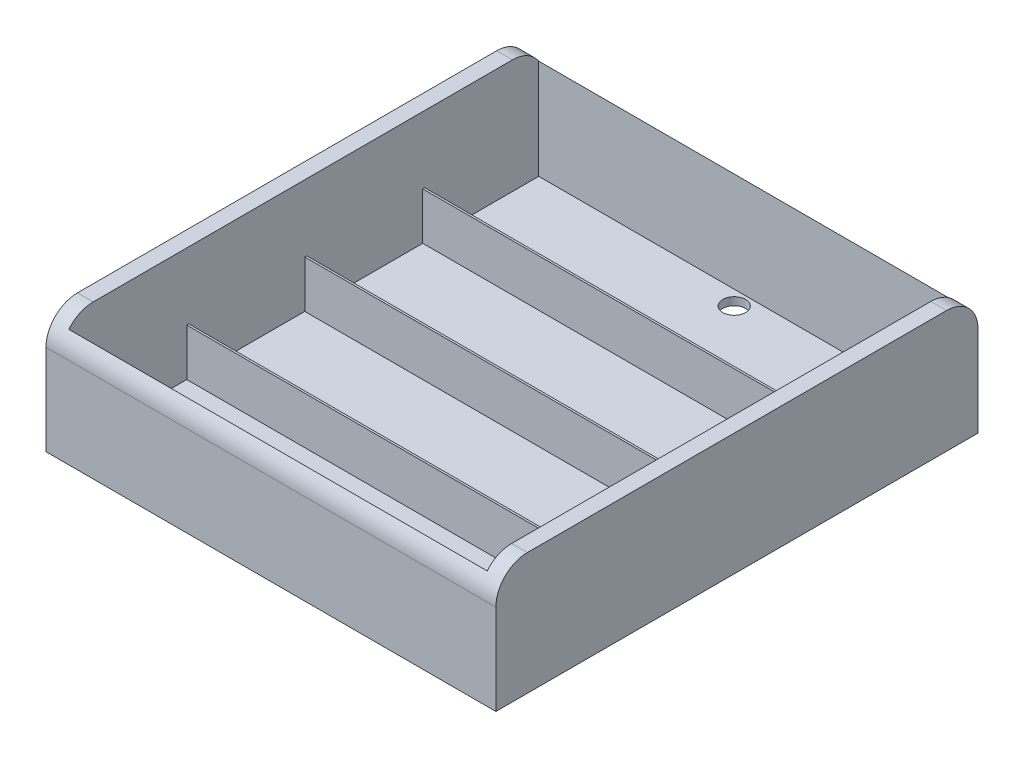
ISO-10303-21;
HEADER;
FILE_DESCRIPTION(('STEP AP214'),'2;1');
FILE_NAME('part.step','',(''),(''),'','','');
FILE_SCHEMA(('AUTOMOTIVE_DESIGN { 1 0 10303 214 1 1 1 1 }'));
ENDSEC;
DATA;
#1=APPLICATION_CONTEXT('core data for automotive mechanical design processes');
#2=APPLICATION_PROTOCOL_DEFINITION('international standard','automotive_design',2000,#1);
#3=PRODUCT_CONTEXT('',#1,'mechanical');
#4=PRODUCT('Part','Part','',(#3));
#5=PRODUCT_RELATED_PRODUCT_CATEGORY('part','',(#4));
#6=PRODUCT_DEFINITION_FORMATION('','',#4);
#7=PRODUCT_DEFINITION_CONTEXT('part definition',#1,'design');
#8=PRODUCT_DEFINITION('design','',#6,#7);
#9=PRODUCT_DEFINITION_SHAPE('','',#8);
#10=(LENGTH_UNIT() NAMED_UNIT(*) SI_UNIT(.MILLI.,.METRE.));
#11=(NAMED_UNIT(*) PLANE_ANGLE_UNIT() SI_UNIT($,.RADIAN.));
#12=(NAMED_UNIT(*) SI_UNIT($,.STERADIAN.) SOLID_ANGLE_UNIT());
#13=UNCERTAINTY_MEASURE_WITH_UNIT(LENGTH_MEASURE(1.E-05),#10,'distance_accuracy_value','');
#14=(GEOMETRIC_REPRESENTATION_CONTEXT(3) GLOBAL_UNCERTAINTY_ASSIGNED_CONTEXT((#13)) GLOBAL_UNIT_ASSIGNED_CONTEXT((#10,
#11,#12)) REPRESENTATION_CONTEXT('',''));
#15=CARTESIAN_POINT('',(0.,0.,0.));
#16=DIRECTION('',(0.,0.,1.));
#17=DIRECTION('',(1.,0.,0.));
#18=AXIS2_PLACEMENT_3D('',#15,#16,#17);
#19=CARTESIAN_POINT('',(0.,1.,-61.3));
#20=DIRECTION('',(0.,-1.,0.));
#21=DIRECTION('',(0.,0.,-1.));
#22=AXIS2_PLACEMENT_3D('',#19,#20,#21);
#23=PLANE('',#22);
#24=DIRECTION('',(1.,0.,0.));
#25=VECTOR('',#24,1.);
#26=CARTESIAN_POINT('',(1.99999999999999,1.,-45.9));
#27=LINE('',#26,#25);
#28=CARTESIAN_POINT('',(1.99999999999999,1.,-45.9));
#29=VERTEX_POINT('',#28);
#30=CARTESIAN_POINT('',(55.2,1.,-45.9));
#31=VERTEX_POINT('',#30);
#32=EDGE_CURVE('E426',#29,#31,#27,.T.);
#33=ORIENTED_EDGE('',*,*,#32,.F.);
#34=DIRECTION('',(0.,0.,1.));
#35=VECTOR('',#34,1.);
#36=CARTESIAN_POINT('',(1.99999999999999,1.,-60.65));
#37=LINE('',#36,#35);
#38=CARTESIAN_POINT('',(1.99999999999999,1.,-31.15));
#39=VERTEX_POINT('',#38);
#40=EDGE_CURVE('E218',#29,#39,#37,.T.);
#41=ORIENTED_EDGE('',*,*,#40,.T.);
#42=DIRECTION('',(-1.,0.,0.));
#43=VECTOR('',#42,1.);
#44=CARTESIAN_POINT('',(1.99999999999999,1.,-31.15));
#45=LINE('',#44,#43);
#46=CARTESIAN_POINT('',(55.2,1.,-31.15));
#47=VERTEX_POINT('',#46);
#48=EDGE_CURVE('E221',#47,#39,#45,.T.);
#49=ORIENTED_EDGE('',*,*,#48,.F.);
#50=DIRECTION('',(0.,0.,-1.));
#51=VECTOR('',#50,1.);
#52=CARTESIAN_POINT('',(55.2,1.,-60.65));
#53=LINE('',#52,#51);
#54=EDGE_CURVE('E435',#47,#31,#53,.T.);
#55=ORIENTED_EDGE('',*,*,#54,.T.);
#56=EDGE_LOOP('',(#33,#41,#49,#55));
#57=FACE_BOUND('',#56,.T.);
#58=ADVANCED_FACE('F35',(#57),#23,.F.);
#59=CARTESIAN_POINT('',(28.7,1.,-58.8));
#60=DIRECTION('',(0.,-1.,0.));
#61=DIRECTION('',(0.,0.,-1.));
#62=AXIS2_PLACEMENT_3D('',#59,#60,#61);
#63=CIRCLE('',#62,1.44999999999999);
#64=CARTESIAN_POINT('',(28.7,1.,-60.25));
#65=VERTEX_POINT('',#64);
#66=EDGE_CURVE('E303',#65,#65,#63,.F.);
#67=ORIENTED_EDGE('',*,*,#66,.F.);
#68=EDGE_LOOP('',(#67));
#69=FACE_BOUND('',#68,.T.);
#70=DIRECTION('',(-1.,0.,0.));
#71=VECTOR('',#70,1.);
#72=CARTESIAN_POINT('',(1.99999999999999,1.,-46.15));
#73=LINE('',#72,#71);
#74=CARTESIAN_POINT('',(55.2,1.,-46.15));
#75=VERTEX_POINT('',#74);
#76=CARTESIAN_POINT('',(1.99999999999999,1.,-46.15));
#77=VERTEX_POINT('',#76);
#78=EDGE_CURVE('E214',#75,#77,#73,.T.);
#79=ORIENTED_EDGE('',*,*,#78,.F.);
#80=CARTESIAN_POINT('',(55.2,1.,-60.65));
#81=VERTEX_POINT('',#80);
#82=EDGE_CURVE('E294',#75,#81,#53,.T.);
#83=ORIENTED_EDGE('',*,*,#82,.T.);
#84=DIRECTION('',(-1.,0.,0.));
#85=VECTOR('',#84,1.);
#86=CARTESIAN_POINT('',(1.99999999999999,1.,-60.65));
#87=LINE('',#86,#85);
#88=CARTESIAN_POINT('',(1.99999999999999,1.,-60.65));
#89=VERTEX_POINT('',#88);
#90=EDGE_CURVE('E285',#81,#89,#87,.T.);
#91=ORIENTED_EDGE('',*,*,#90,.T.);
#92=EDGE_CURVE('E280',#89,#77,#37,.T.);
#93=ORIENTED_EDGE('',*,*,#92,.T.);
#94=EDGE_LOOP('',(#79,#83,#91,#93));
#95=FACE_BOUND('',#94,.T.);
#96=ADVANCED_FACE('F439',(#69,#95),#23,.F.);
#97=CARTESIAN_POINT('',(55.2,-80.0018906026602,-60.65));
#98=DIRECTION('',(1.,0.,0.));
#99=DIRECTION('',(0.,0.,-1.));
#100=AXIS2_PLACEMENT_3D('',#97,#98,#99);
#101=PLANE('',#100);
#102=DIRECTION('',(0.,-1.,0.));
#103=VECTOR('',#102,1.);
#104=CARTESIAN_POINT('',(55.2,7.,-45.9));
#105=LINE('',#104,#103);
#106=CARTESIAN_POINT('',(55.2,7.,-45.9));
#107=VERTEX_POINT('',#106);
#108=EDGE_CURVE('E204',#107,#31,#105,.T.);
#109=ORIENTED_EDGE('',*,*,#108,.T.);
#110=ORIENTED_EDGE('',*,*,#54,.F.);
#111=DIRECTION('',(0.,-1.,0.));
#112=VECTOR('',#111,1.);
#113=CARTESIAN_POINT('',(55.2,7.,-31.15));
#114=LINE('',#113,#112);
#115=CARTESIAN_POINT('',(55.2,7.,-31.15));
#116=VERTEX_POINT('',#115);
#117=EDGE_CURVE('E238',#116,#47,#114,.T.);
#118=ORIENTED_EDGE('',*,*,#117,.F.);
#119=DIRECTION('',(0.,0.,-1.));
#120=VECTOR('',#119,1.);
#121=CARTESIAN_POINT('',(55.2,7.,-31.15));
#122=LINE('',#121,#120);
#123=CARTESIAN_POINT('',(55.2,7.,-30.9));
#124=VERTEX_POINT('',#123);
#125=EDGE_CURVE('E232',#124,#116,#122,.T.);
#126=ORIENTED_EDGE('',*,*,#125,.F.);
#127=DIRECTION('',(0.,-1.,0.));
#128=VECTOR('',#127,1.);
#129=CARTESIAN_POINT('',(55.2,7.,-30.9));
#130=LINE('',#129,#128);
#131=CARTESIAN_POINT('',(55.2,1.,-30.9));
#132=VERTEX_POINT('',#131);
#133=EDGE_CURVE('E240',#124,#132,#130,.T.);
#134=ORIENTED_EDGE('',*,*,#133,.T.);
#135=CARTESIAN_POINT('',(55.2,1.,-16.15));
#136=VERTEX_POINT('',#135);
#137=EDGE_CURVE('E293',#136,#132,#53,.T.);
#138=ORIENTED_EDGE('',*,*,#137,.F.);
#139=DIRECTION('',(0.,-1.,0.));
#140=VECTOR('',#139,1.);
#141=CARTESIAN_POINT('',(55.2,7.,-16.15));
#142=LINE('',#141,#140);
#143=CARTESIAN_POINT('',(55.2,7.,-16.15));
#144=VERTEX_POINT('',#143);
#145=EDGE_CURVE('E263',#144,#136,#142,.T.);
#146=ORIENTED_EDGE('',*,*,#145,.F.);
#147=DIRECTION('',(0.,0.,-1.));
#148=VECTOR('',#147,1.);
#149=CARTESIAN_POINT('',(55.2,7.,-16.15));
#150=LINE('',#149,#148);
#151=CARTESIAN_POINT('',(55.2,7.,-15.9));
#152=VERTEX_POINT('',#151);
#153=EDGE_CURVE('E252',#152,#144,#150,.T.);
#154=ORIENTED_EDGE('',*,*,#153,.F.);
#155=DIRECTION('',(0.,-1.,0.));
#156=VECTOR('',#155,1.);
#157=CARTESIAN_POINT('',(55.2,7.,-15.9));
#158=LINE('',#157,#156);
#159=CARTESIAN_POINT('',(55.2,1.,-15.9));
#160=VERTEX_POINT('',#159);
#161=EDGE_CURVE('E265',#152,#160,#158,.T.);
#162=ORIENTED_EDGE('',*,*,#161,.T.);
#163=CARTESIAN_POINT('',(55.2,1.,-0.9));
#164=VERTEX_POINT('',#163);
#165=EDGE_CURVE('E290',#164,#160,#53,.T.);
#166=ORIENTED_EDGE('',*,*,#165,.F.);
#167=DIRECTION('',(0.,1.,0.));
#168=VECTOR('',#167,1.);
#169=CARTESIAN_POINT('',(55.2,-80.0018906026602,-0.9));
#170=LINE('',#169,#168);
#171=CARTESIAN_POINT('',(55.2,14.0278449319529,-0.9));
#172=VERTEX_POINT('',#171);
#173=EDGE_CURVE('E279',#164,#172,#170,.T.);
#174=ORIENTED_EDGE('',*,*,#173,.T.);
#175=CARTESIAN_POINT('',(55.2,11.5,-4.));
#176=DIRECTION('',(1.,0.,0.));
#177=DIRECTION('',(0.,0.,-1.));
#178=AXIS2_PLACEMENT_3D('',#175,#176,#177);
#179=CIRCLE('',#178,4.);
#180=CARTESIAN_POINT('',(55.2,15.5,-4.));
#181=VERTEX_POINT('',#180);
#182=EDGE_CURVE('E351',#172,#181,#179,.F.);
#183=ORIENTED_EDGE('',*,*,#182,.T.);
#184=DIRECTION('',(0.,0.,-1.));
#185=VECTOR('',#184,1.);
#186=CARTESIAN_POINT('',(55.2,15.5,-60.65));
#187=LINE('',#186,#185);
#188=CARTESIAN_POINT('',(55.2,15.5,-57.3));
#189=VERTEX_POINT('',#188);
#190=EDGE_CURVE('E271',#181,#189,#187,.T.);
#191=ORIENTED_EDGE('',*,*,#190,.T.);
#192=CARTESIAN_POINT('',(55.2,11.5,-57.3));
#193=DIRECTION('',(1.,0.,0.));
#194=DIRECTION('',(0.,0.,-1.));
#195=AXIS2_PLACEMENT_3D('',#192,#193,#194);
#196=CIRCLE('',#195,4.);
#197=CARTESIAN_POINT('',(55.2,13.6857492994394,-60.65));
#198=VERTEX_POINT('',#197);
#199=EDGE_CURVE('E353',#189,#198,#196,.F.);
#200=ORIENTED_EDGE('',*,*,#199,.T.);
#201=DIRECTION('',(0.,1.,0.));
#202=VECTOR('',#201,1.);
#203=CARTESIAN_POINT('',(55.2,-80.0018906026602,-60.65));
#204=LINE('',#203,#202);
#205=EDGE_CURVE('E289',#81,#198,#204,.T.);
#206=ORIENTED_EDGE('',*,*,#205,.F.);
#207=ORIENTED_EDGE('',*,*,#82,.F.);
#208=DIRECTION('',(0.,-1.,0.));
#209=VECTOR('',#208,1.);
#210=CARTESIAN_POINT('',(55.2,7.,-46.15));
#211=LINE('',#210,#209);
#212=CARTESIAN_POINT('',(55.2,7.,-46.15));
#213=VERTEX_POINT('',#212);
#214=EDGE_CURVE('E223',#213,#75,#211,.T.);
#215=ORIENTED_EDGE('',*,*,#214,.F.);
#216=DIRECTION('',(0.,0.,-1.));
#217=VECTOR('',#216,1.);
#218=CARTESIAN_POINT('',(55.2,7.,-46.15));
#219=LINE('',#218,#217);
#220=EDGE_CURVE('E207',#107,#213,#219,.T.);
#221=ORIENTED_EDGE('',*,*,#220,.F.);
#222=EDGE_LOOP('',(#109,#110,#118,#126,#134,#138,#146,#154,#162,#166,#174,#183,#191,#200,#206,
#207,#215,#221));
#223=FACE_BOUND('',#222,.T.);
#224=ADVANCED_FACE('F379',(#223),#101,.F.);
#225=CARTESIAN_POINT('',(1.99999999999999,-80.0018906026602,-60.65));
#226=DIRECTION('',(-1.,0.,0.));
#227=DIRECTION('',(0.,0.,1.));
#228=AXIS2_PLACEMENT_3D('',#225,#226,#227);
#229=PLANE('',#228);
#230=DIRECTION('',(0.,-1.,0.));
#231=VECTOR('',#230,1.);
#232=CARTESIAN_POINT('',(1.99999999999999,7.,-45.9));
#233=LINE('',#232,#231);
#234=CARTESIAN_POINT('',(1.99999999999999,7.,-45.9));
#235=VERTEX_POINT('',#234);
#236=EDGE_CURVE('E201',#235,#29,#233,.T.);
#237=ORIENTED_EDGE('',*,*,#236,.F.);
#238=DIRECTION('',(0.,0.,1.));
#239=VECTOR('',#238,1.);
#240=CARTESIAN_POINT('',(1.99999999999999,7.,-46.15));
#241=LINE('',#240,#239);
#242=CARTESIAN_POINT('',(1.99999999999999,7.00000000000001,-46.15));
#243=VERTEX_POINT('',#242);
#244=EDGE_CURVE('E208',#243,#235,#241,.T.);
#245=ORIENTED_EDGE('',*,*,#244,.F.);
#246=DIRECTION('',(0.,-1.,0.));
#247=VECTOR('',#246,1.);
#248=CARTESIAN_POINT('',(1.99999999999999,7.,-46.15));
#249=LINE('',#248,#247);
#250=EDGE_CURVE('E50',#243,#77,#249,.T.);
#251=ORIENTED_EDGE('',*,*,#250,.T.);
#252=ORIENTED_EDGE('',*,*,#92,.F.);
#253=DIRECTION('',(0.,1.,0.));
#254=VECTOR('',#253,1.);
#255=CARTESIAN_POINT('',(1.99999999999999,-80.0018906026602,-60.65));
#256=LINE('',#255,#254);
#257=CARTESIAN_POINT('',(1.99999999999999,13.6857492994394,-60.65));
#258=VERTEX_POINT('',#257);
#259=EDGE_CURVE('E288',#89,#258,#256,.T.);
#260=ORIENTED_EDGE('',*,*,#259,.T.);
#261=CARTESIAN_POINT('',(1.99999999999999,11.5,-57.3));
#262=DIRECTION('',(-1.,0.,0.));
#263=DIRECTION('',(0.,0.,1.));
#264=AXIS2_PLACEMENT_3D('',#261,#262,#263);
#265=CIRCLE('',#264,4.);
#266=CARTESIAN_POINT('',(1.99999999999999,15.5,-57.3));
#267=VERTEX_POINT('',#266);
#268=EDGE_CURVE('E359',#258,#267,#265,.F.);
#269=ORIENTED_EDGE('',*,*,#268,.T.);
#270=DIRECTION('',(0.,0.,1.));
#271=VECTOR('',#270,1.);
#272=CARTESIAN_POINT('',(1.99999999999999,15.5,-60.65));
#273=LINE('',#272,#271);
#274=CARTESIAN_POINT('',(2.,15.5,-4.));
#275=VERTEX_POINT('',#274);
#276=EDGE_CURVE('E270',#267,#275,#273,.T.);
#277=ORIENTED_EDGE('',*,*,#276,.T.);
#278=CARTESIAN_POINT('',(2.,11.5,-4.));
#279=DIRECTION('',(-1.,0.,0.));
#280=DIRECTION('',(0.,0.,1.));
#281=AXIS2_PLACEMENT_3D('',#278,#279,#280);
#282=CIRCLE('',#281,4.);
#283=CARTESIAN_POINT('',(2.,14.0278449319529,-0.9));
#284=VERTEX_POINT('',#283);
#285=EDGE_CURVE('E357',#275,#284,#282,.F.);
#286=ORIENTED_EDGE('',*,*,#285,.T.);
#287=DIRECTION('',(0.,1.,0.));
#288=VECTOR('',#287,1.);
#289=CARTESIAN_POINT('',(2.,-80.0018906026602,-0.9));
#290=LINE('',#289,#288);
#291=CARTESIAN_POINT('',(2.,1.,-0.9));
#292=VERTEX_POINT('',#291);
#293=EDGE_CURVE('E283',#292,#284,#290,.T.);
#294=ORIENTED_EDGE('',*,*,#293,.F.);
#295=CARTESIAN_POINT('',(1.99999999999999,1.,-15.9));
#296=VERTEX_POINT('',#295);
#297=EDGE_CURVE('E284',#296,#292,#37,.T.);
#298=ORIENTED_EDGE('',*,*,#297,.F.);
#299=DIRECTION('',(0.,-1.,0.));
#300=VECTOR('',#299,1.);
#301=CARTESIAN_POINT('',(1.99999999999999,7.,-15.9));
#302=LINE('',#301,#300);
#303=CARTESIAN_POINT('',(1.99999999999999,7.,-15.9));
#304=VERTEX_POINT('',#303);
#305=EDGE_CURVE('E268',#304,#296,#302,.T.);
#306=ORIENTED_EDGE('',*,*,#305,.F.);
#307=DIRECTION('',(0.,0.,1.));
#308=VECTOR('',#307,1.);
#309=CARTESIAN_POINT('',(1.99999999999999,7.,-16.15));
#310=LINE('',#309,#308);
#311=CARTESIAN_POINT('',(1.99999999999999,7.00000000000001,-16.15));
#312=VERTEX_POINT('',#311);
#313=EDGE_CURVE('E246',#312,#304,#310,.T.);
#314=ORIENTED_EDGE('',*,*,#313,.F.);
#315=DIRECTION('',(0.,-1.,0.));
#316=VECTOR('',#315,1.);
#317=CARTESIAN_POINT('',(1.99999999999999,7.,-16.15));
#318=LINE('',#317,#316);
#319=CARTESIAN_POINT('',(1.99999999999999,1.,-16.15));
#320=VERTEX_POINT('',#319);
#321=EDGE_CURVE('E257',#312,#320,#318,.T.);
#322=ORIENTED_EDGE('',*,*,#321,.T.);
#323=CARTESIAN_POINT('',(1.99999999999999,1.,-30.9));
#324=VERTEX_POINT('',#323);
#325=EDGE_CURVE('E417',#324,#320,#37,.T.);
#326=ORIENTED_EDGE('',*,*,#325,.F.);
#327=DIRECTION('',(0.,-1.,0.));
#328=VECTOR('',#327,1.);
#329=CARTESIAN_POINT('',(1.99999999999999,7.,-30.9));
#330=LINE('',#329,#328);
#331=CARTESIAN_POINT('',(1.99999999999999,7.,-30.9));
#332=VERTEX_POINT('',#331);
#333=EDGE_CURVE('E243',#332,#324,#330,.T.);
#334=ORIENTED_EDGE('',*,*,#333,.F.);
#335=DIRECTION('',(0.,0.,1.));
#336=VECTOR('',#335,1.);
#337=CARTESIAN_POINT('',(1.99999999999999,7.,-31.15));
#338=LINE('',#337,#336);
#339=CARTESIAN_POINT('',(1.99999999999999,7.00000000000001,-31.15));
#340=VERTEX_POINT('',#339);
#341=EDGE_CURVE('E227',#340,#332,#338,.T.);
#342=ORIENTED_EDGE('',*,*,#341,.F.);
#343=DIRECTION('',(0.,-1.,0.));
#344=VECTOR('',#343,1.);
#345=CARTESIAN_POINT('',(1.99999999999999,7.,-31.15));
#346=LINE('',#345,#344);
#347=EDGE_CURVE('E58',#340,#39,#346,.T.);
#348=ORIENTED_EDGE('',*,*,#347,.T.);
#349=ORIENTED_EDGE('',*,*,#40,.F.);
#350=EDGE_LOOP('',(#237,#245,#251,#252,#260,#269,#277,#286,#294,#298,#306,#314,#322,#326,#334,
#342,#348,#349));
#351=FACE_BOUND('',#350,.T.);
#352=ADVANCED_FACE('F217',(#351),#229,.F.);
#353=DIRECTION('',(1.,0.,0.));
#354=VECTOR('',#353,1.);
#355=CARTESIAN_POINT('',(1.99999999999999,1.,-30.9));
#356=LINE('',#355,#354);
#357=EDGE_CURVE('E219',#324,#132,#356,.T.);
#358=ORIENTED_EDGE('',*,*,#357,.F.);
#359=ORIENTED_EDGE('',*,*,#325,.T.);
#360=DIRECTION('',(-1.,0.,0.));
#361=VECTOR('',#360,1.);
#362=CARTESIAN_POINT('',(1.99999999999999,1.,-16.15));
#363=LINE('',#362,#361);
#364=EDGE_CURVE('E250',#136,#320,#363,.T.);
#365=ORIENTED_EDGE('',*,*,#364,.F.);
#366=ORIENTED_EDGE('',*,*,#137,.T.);
#367=EDGE_LOOP('',(#358,#359,#365,#366));
#368=FACE_BOUND('',#367,.T.);
#369=ADVANCED_FACE('F462',(#368),#23,.F.);
#370=CARTESIAN_POINT('',(28.7,1.,-3.69999999999999));
#371=DIRECTION('',(0.,-1.,0.));
#372=DIRECTION('',(0.,0.,-1.));
#373=AXIS2_PLACEMENT_3D('',#370,#371,#372);
#374=CIRCLE('',#373,1.44999999999999);
#375=CARTESIAN_POINT('',(28.7,1.,-5.14999999999999));
#376=VERTEX_POINT('',#375);
#377=EDGE_CURVE('E304',#376,#376,#374,.F.);
#378=ORIENTED_EDGE('',*,*,#377,.F.);
#379=EDGE_LOOP('',(#378));
#380=FACE_BOUND('',#379,.T.);
#381=DIRECTION('',(1.,0.,0.));
#382=VECTOR('',#381,1.);
#383=CARTESIAN_POINT('',(1.99999999999999,1.,-15.9));
#384=LINE('',#383,#382);
#385=EDGE_CURVE('E245',#296,#160,#384,.T.);
#386=ORIENTED_EDGE('',*,*,#385,.F.);
#387=ORIENTED_EDGE('',*,*,#297,.T.);
#388=DIRECTION('',(1.,0.,0.));
#389=VECTOR('',#388,1.);
#390=CARTESIAN_POINT('',(2.,1.,-0.9));
#391=LINE('',#390,#389);
#392=EDGE_CURVE('E274',#292,#164,#391,.T.);
#393=ORIENTED_EDGE('',*,*,#392,.T.);
#394=ORIENTED_EDGE('',*,*,#165,.T.);
#395=EDGE_LOOP('',(#386,#387,#393,#394));
#396=FACE_BOUND('',#395,.T.);
#397=ADVANCED_FACE('F457',(#380,#396),#23,.F.);
#398=CARTESIAN_POINT('',(0.,15.5,-61.3));
#399=DIRECTION('',(0.,-1.,0.));
#400=DIRECTION('',(0.,0.,-1.));
#401=AXIS2_PLACEMENT_3D('',#398,#399,#400);
#402=PLANE('',#401);
#403=DIRECTION('',(0.,0.,-1.));
#404=VECTOR('',#403,1.);
#405=CARTESIAN_POINT('',(57.2,15.5,0.));
#406=LINE('',#405,#404);
#407=CARTESIAN_POINT('',(57.2,15.5,-4.));
#408=VERTEX_POINT('',#407);
#409=CARTESIAN_POINT('',(57.2,15.5,-57.3));
#410=VERTEX_POINT('',#409);
#411=EDGE_CURVE('E317',#408,#410,#406,.T.);
#412=ORIENTED_EDGE('',*,*,#411,.T.);
#413=DIRECTION('',(-1.,0.,0.));
#414=VECTOR('',#413,1.);
#415=CARTESIAN_POINT('',(0.,15.5,-57.3));
#416=LINE('',#415,#414);
#417=EDGE_CURVE('E348',#410,#189,#416,.T.);
#418=ORIENTED_EDGE('',*,*,#417,.T.);
#419=ORIENTED_EDGE('',*,*,#190,.F.);
#420=DIRECTION('',(1.,0.,0.));
#421=VECTOR('',#420,1.);
#422=CARTESIAN_POINT('',(0.,15.5,-4.));
#423=LINE('',#422,#421);
#424=EDGE_CURVE('E339',#181,#408,#423,.T.);
#425=ORIENTED_EDGE('',*,*,#424,.T.);
#426=EDGE_LOOP('',(#412,#418,#419,#425));
#427=FACE_BOUND('',#426,.T.);
#428=ADVANCED_FACE('F387',(#427),#402,.F.);
#429=CARTESIAN_POINT('',(0.,0.,-61.3));
#430=DIRECTION('',(0.,-1.,0.));
#431=DIRECTION('',(0.,0.,-1.));
#432=AXIS2_PLACEMENT_3D('',#429,#430,#431);
#433=PLANE('',#432);
#434=DIRECTION('',(0.,0.,1.));
#435=VECTOR('',#434,1.);
#436=CARTESIAN_POINT('',(0.,0.,0.));
#437=LINE('',#436,#435);
#438=CARTESIAN_POINT('',(0.,0.,-61.3));
#439=VERTEX_POINT('',#438);
#440=CARTESIAN_POINT('',(0.,0.,0.));
#441=VERTEX_POINT('',#440);
#442=EDGE_CURVE('E313',#439,#441,#437,.T.);
#443=ORIENTED_EDGE('',*,*,#442,.F.);
#444=DIRECTION('',(-1.,0.,0.));
#445=VECTOR('',#444,1.);
#446=CARTESIAN_POINT('',(0.,0.,-61.3));
#447=LINE('',#446,#445);
#448=CARTESIAN_POINT('',(57.2,0.,-61.3));
#449=VERTEX_POINT('',#448);
#450=EDGE_CURVE('E318',#449,#439,#447,.T.);
#451=ORIENTED_EDGE('',*,*,#450,.F.);
#452=DIRECTION('',(0.,0.,-1.));
#453=VECTOR('',#452,1.);
#454=CARTESIAN_POINT('',(57.2,0.,0.));
#455=LINE('',#454,#453);
#456=CARTESIAN_POINT('',(57.2,0.,0.));
#457=VERTEX_POINT('',#456);
#458=EDGE_CURVE('E327',#457,#449,#455,.T.);
#459=ORIENTED_EDGE('',*,*,#458,.F.);
#460=DIRECTION('',(1.,0.,0.));
#461=VECTOR('',#460,1.);
#462=CARTESIAN_POINT('',(0.,0.,0.));
#463=LINE('',#462,#461);
#464=EDGE_CURVE('E324',#441,#457,#463,.T.);
#465=ORIENTED_EDGE('',*,*,#464,.F.);
#466=EDGE_LOOP('',(#443,#451,#459,#465));
#467=FACE_BOUND('',#466,.T.);
#468=CARTESIAN_POINT('',(28.7,0.,-3.69999999999999));
#469=DIRECTION('',(0.,1.,0.));
#470=DIRECTION('',(0.,0.,1.));
#471=AXIS2_PLACEMENT_3D('',#468,#469,#470);
#472=CIRCLE('',#471,1.45);
#473=CARTESIAN_POINT('',(28.7,0.,-2.25));
#474=VERTEX_POINT('',#473);
#475=EDGE_CURVE('E310',#474,#474,#472,.T.);
#476=ORIENTED_EDGE('',*,*,#475,.T.);
#477=EDGE_LOOP('',(#476));
#478=FACE_BOUND('',#477,.T.);
#479=CARTESIAN_POINT('',(28.7,0.,-58.8));
#480=DIRECTION('',(0.,1.,0.));
#481=DIRECTION('',(0.,0.,1.));
#482=AXIS2_PLACEMENT_3D('',#479,#480,#481);
#483=CIRCLE('',#482,1.45);
#484=CARTESIAN_POINT('',(28.7,0.,-57.35));
#485=VERTEX_POINT('',#484);
#486=EDGE_CURVE('E307',#485,#485,#483,.T.);
#487=ORIENTED_EDGE('',*,*,#486,.T.);
#488=EDGE_LOOP('',(#487));
#489=FACE_BOUND('',#488,.T.);
#490=ADVANCED_FACE('F471',(#467,#478,#489),#433,.T.);
#491=ORIENTED_EDGE('',*,*,#276,.F.);
#492=DIRECTION('',(-1.,0.,0.));
#493=VECTOR('',#492,1.);
#494=CARTESIAN_POINT('',(0.,15.5,-57.3));
#495=LINE('',#494,#493);
#496=CARTESIAN_POINT('',(0.,15.5,-57.3));
#497=VERTEX_POINT('',#496);
#498=EDGE_CURVE('E346',#267,#497,#495,.T.);
#499=ORIENTED_EDGE('',*,*,#498,.T.);
#500=DIRECTION('',(0.,0.,1.));
#501=VECTOR('',#500,1.);
#502=CARTESIAN_POINT('',(0.,15.5,0.));
#503=LINE('',#502,#501);
#504=CARTESIAN_POINT('',(0.,15.5,-4.));
#505=VERTEX_POINT('',#504);
#506=EDGE_CURVE('E314',#497,#505,#503,.T.);
#507=ORIENTED_EDGE('',*,*,#506,.T.);
#508=DIRECTION('',(1.,0.,0.));
#509=VECTOR('',#508,1.);
#510=CARTESIAN_POINT('',(0.,15.5,-4.));
#511=LINE('',#510,#509);
#512=EDGE_CURVE('E343',#505,#275,#511,.T.);
#513=ORIENTED_EDGE('',*,*,#512,.T.);
#514=EDGE_LOOP('',(#491,#499,#507,#513));
#515=FACE_BOUND('',#514,.T.);
#516=ADVANCED_FACE('F409',(#515),#402,.F.);
#517=CARTESIAN_POINT('',(0.,15.5,0.));
#518=DIRECTION('',(1.,0.,0.));
#519=DIRECTION('',(0.,0.,-1.));
#520=AXIS2_PLACEMENT_3D('',#517,#518,#519);
#521=PLANE('',#520);
#522=ORIENTED_EDGE('',*,*,#506,.F.);
#523=CARTESIAN_POINT('',(0.,11.5,-57.3));
#524=DIRECTION('',(1.,0.,0.));
#525=DIRECTION('',(0.,0.,-1.));
#526=AXIS2_PLACEMENT_3D('',#523,#524,#525);
#527=CIRCLE('',#526,4.);
#528=CARTESIAN_POINT('',(0.,11.5,-61.3));
#529=VERTEX_POINT('',#528);
#530=EDGE_CURVE('E363',#497,#529,#527,.F.);
#531=ORIENTED_EDGE('',*,*,#530,.T.);
#532=DIRECTION('',(0.,-1.,0.));
#533=VECTOR('',#532,1.);
#534=CARTESIAN_POINT('',(0.,15.5,-61.3));
#535=LINE('',#534,#533);
#536=EDGE_CURVE('E321',#529,#439,#535,.T.);
#537=ORIENTED_EDGE('',*,*,#536,.T.);
#538=ORIENTED_EDGE('',*,*,#442,.T.);
#539=DIRECTION('',(0.,-1.,0.));
#540=VECTOR('',#539,1.);
#541=CARTESIAN_POINT('',(0.,15.5,0.));
#542=LINE('',#541,#540);
#543=CARTESIAN_POINT('',(0.,11.5,0.));
#544=VERTEX_POINT('',#543);
#545=EDGE_CURVE('E337',#544,#441,#542,.T.);
#546=ORIENTED_EDGE('',*,*,#545,.F.);
#547=CARTESIAN_POINT('',(0.,11.5,-4.));
#548=DIRECTION('',(1.,0.,0.));
#549=DIRECTION('',(0.,0.,-1.));
#550=AXIS2_PLACEMENT_3D('',#547,#548,#549);
#551=CIRCLE('',#550,4.);
#552=EDGE_CURVE('E361',#544,#505,#551,.F.);
#553=ORIENTED_EDGE('',*,*,#552,.T.);
#554=EDGE_LOOP('',(#522,#531,#537,#538,#546,#553));
#555=FACE_BOUND('',#554,.T.);
#556=ADVANCED_FACE('F522',(#555),#521,.F.);
#557=CARTESIAN_POINT('',(0.,15.5,0.));
#558=DIRECTION('',(0.,0.,-1.));
#559=DIRECTION('',(-1.,0.,0.));
#560=AXIS2_PLACEMENT_3D('',#557,#558,#559);
#561=PLANE('',#560);
#562=DIRECTION('',(0.,-1.,0.));
#563=VECTOR('',#562,1.);
#564=CARTESIAN_POINT('',(57.2,15.5,0.));
#565=LINE('',#564,#563);
#566=CARTESIAN_POINT('',(57.2,11.5,0.));
#567=VERTEX_POINT('',#566);
#568=EDGE_CURVE('E335',#567,#457,#565,.T.);
#569=ORIENTED_EDGE('',*,*,#568,.F.);
#570=DIRECTION('',(1.,0.,0.));
#571=VECTOR('',#570,1.);
#572=CARTESIAN_POINT('',(0.,11.5,0.));
#573=LINE('',#572,#571);
#574=EDGE_CURVE('E12',#567,#544,#573,.F.);
#575=ORIENTED_EDGE('',*,*,#574,.T.);
#576=ORIENTED_EDGE('',*,*,#545,.T.);
#577=ORIENTED_EDGE('',*,*,#464,.T.);
#578=EDGE_LOOP('',(#569,#575,#576,#577));
#579=FACE_BOUND('',#578,.T.);
#580=ADVANCED_FACE('F531',(#579),#561,.F.);
#581=CARTESIAN_POINT('',(57.2,15.5,0.));
#582=DIRECTION('',(-1.,0.,0.));
#583=DIRECTION('',(0.,0.,1.));
#584=AXIS2_PLACEMENT_3D('',#581,#582,#583);
#585=PLANE('',#584);
#586=DIRECTION('',(0.,-1.,0.));
#587=VECTOR('',#586,1.);
#588=CARTESIAN_POINT('',(57.2,15.5,-61.3));
#589=LINE('',#588,#587);
#590=CARTESIAN_POINT('',(57.2,11.5,-61.3));
#591=VERTEX_POINT('',#590);
#592=EDGE_CURVE('E333',#591,#449,#589,.T.);
#593=ORIENTED_EDGE('',*,*,#592,.F.);
#594=CARTESIAN_POINT('',(57.2,11.5,-57.3));
#595=DIRECTION('',(-1.,0.,0.));
#596=DIRECTION('',(0.,0.,1.));
#597=AXIS2_PLACEMENT_3D('',#594,#595,#596);
#598=CIRCLE('',#597,4.);
#599=EDGE_CURVE('E369',#591,#410,#598,.F.);
#600=ORIENTED_EDGE('',*,*,#599,.T.);
#601=ORIENTED_EDGE('',*,*,#411,.F.);
#602=CARTESIAN_POINT('',(57.2,11.5,-4.));
#603=DIRECTION('',(-1.,0.,0.));
#604=DIRECTION('',(0.,0.,1.));
#605=AXIS2_PLACEMENT_3D('',#602,#603,#604);
#606=CIRCLE('',#605,4.);
#607=EDGE_CURVE('E367',#408,#567,#606,.F.);
#608=ORIENTED_EDGE('',*,*,#607,.T.);
#609=ORIENTED_EDGE('',*,*,#568,.T.);
#610=ORIENTED_EDGE('',*,*,#458,.T.);
#611=EDGE_LOOP('',(#593,#600,#601,#608,#609,#610));
#612=FACE_BOUND('',#611,.T.);
#613=ADVANCED_FACE('F391',(#612),#585,.F.);
#614=CARTESIAN_POINT('',(0.,15.5,-61.3));
#615=DIRECTION('',(0.,0.,1.));
#616=DIRECTION('',(1.,0.,0.));
#617=AXIS2_PLACEMENT_3D('',#614,#615,#616);
#618=PLANE('',#617);
#619=ORIENTED_EDGE('',*,*,#536,.F.);
#620=DIRECTION('',(-1.,0.,0.));
#621=VECTOR('',#620,1.);
#622=CARTESIAN_POINT('',(0.,11.5,-61.3));
#623=LINE('',#622,#621);
#624=EDGE_CURVE('E365',#529,#591,#623,.F.);
#625=ORIENTED_EDGE('',*,*,#624,.T.);
#626=ORIENTED_EDGE('',*,*,#592,.T.);
#627=ORIENTED_EDGE('',*,*,#450,.T.);
#628=EDGE_LOOP('',(#619,#625,#626,#627));
#629=FACE_BOUND('',#628,.T.);
#630=ADVANCED_FACE('F516',(#629),#618,.F.);
#631=CARTESIAN_POINT('',(28.7,15.5,-3.69999999999999));
#632=DIRECTION('',(0.,1.,0.));
#633=DIRECTION('',(0.,0.,1.));
#634=AXIS2_PLACEMENT_3D('',#631,#632,#633);
#635=CYLINDRICAL_SURFACE('',#634,1.44999999999999);
#636=ORIENTED_EDGE('',*,*,#377,.T.);
#637=EDGE_LOOP('',(#636));
#638=FACE_BOUND('',#637,.T.);
#639=ORIENTED_EDGE('',*,*,#475,.F.);
#640=EDGE_LOOP('',(#639));
#641=FACE_BOUND('',#640,.T.);
#642=ADVANCED_FACE('F511',(#638,#641),#635,.F.);
#643=CARTESIAN_POINT('',(28.7,15.5,-58.8));
#644=DIRECTION('',(0.,1.,0.));
#645=DIRECTION('',(0.,0.,1.));
#646=AXIS2_PLACEMENT_3D('',#643,#644,#645);
#647=CYLINDRICAL_SURFACE('',#646,1.44999999999999);
#648=ORIENTED_EDGE('',*,*,#66,.T.);
#649=EDGE_LOOP('',(#648));
#650=FACE_BOUND('',#649,.T.);
#651=ORIENTED_EDGE('',*,*,#486,.F.);
#652=EDGE_LOOP('',(#651));
#653=FACE_BOUND('',#652,.T.);
#654=ADVANCED_FACE('F507',(#650,#653),#647,.F.);
#655=CARTESIAN_POINT('',(2.,-80.0018906026602,-0.9));
#656=DIRECTION('',(0.,0.,1.));
#657=DIRECTION('',(1.,0.,0.));
#658=AXIS2_PLACEMENT_3D('',#655,#656,#657);
#659=PLANE('',#658);
#660=ORIENTED_EDGE('',*,*,#293,.T.);
#661=DIRECTION('',(1.,0.,0.));
#662=VECTOR('',#661,1.);
#663=CARTESIAN_POINT('',(2.,14.0278449319529,-0.9));
#664=LINE('',#663,#662);
#665=EDGE_CURVE('E43',#284,#172,#664,.T.);
#666=ORIENTED_EDGE('',*,*,#665,.T.);
#667=ORIENTED_EDGE('',*,*,#173,.F.);
#668=ORIENTED_EDGE('',*,*,#392,.F.);
#669=EDGE_LOOP('',(#660,#666,#667,#668));
#670=FACE_BOUND('',#669,.T.);
#671=ADVANCED_FACE('F373',(#670),#659,.F.);
#672=CARTESIAN_POINT('',(1.99999999999999,-80.0018906026602,-60.65));
#673=DIRECTION('',(0.,0.,-1.));
#674=DIRECTION('',(-1.,0.,0.));
#675=AXIS2_PLACEMENT_3D('',#672,#673,#674);
#676=PLANE('',#675);
#677=ORIENTED_EDGE('',*,*,#205,.T.);
#678=DIRECTION('',(-1.,0.,0.));
#679=VECTOR('',#678,1.);
#680=CARTESIAN_POINT('',(55.2,13.6857492994394,-60.65));
#681=LINE('',#680,#679);
#682=EDGE_CURVE('E355',#198,#258,#681,.T.);
#683=ORIENTED_EDGE('',*,*,#682,.T.);
#684=ORIENTED_EDGE('',*,*,#259,.F.);
#685=ORIENTED_EDGE('',*,*,#90,.F.);
#686=EDGE_LOOP('',(#677,#683,#684,#685));
#687=FACE_BOUND('',#686,.T.);
#688=ADVANCED_FACE('F403',(#687),#676,.F.);
#689=CARTESIAN_POINT('',(0.,11.5,-57.3));
#690=DIRECTION('',(-1.,0.,0.));
#691=DIRECTION('',(0.,0.,1.));
#692=AXIS2_PLACEMENT_3D('',#689,#690,#691);
#693=CYLINDRICAL_SURFACE('',#692,4.);
#694=ORIENTED_EDGE('',*,*,#599,.F.);
#695=ORIENTED_EDGE('',*,*,#624,.F.);
#696=ORIENTED_EDGE('',*,*,#530,.F.);
#697=ORIENTED_EDGE('',*,*,#498,.F.);
#698=ORIENTED_EDGE('',*,*,#268,.F.);
#699=ORIENTED_EDGE('',*,*,#682,.F.);
#700=ORIENTED_EDGE('',*,*,#199,.F.);
#701=ORIENTED_EDGE('',*,*,#417,.F.);
#702=EDGE_LOOP('',(#694,#695,#696,#697,#698,#699,#700,#701));
#703=FACE_BOUND('',#702,.T.);
#704=ADVANCED_FACE('F396',(#703),#693,.T.);
#705=CARTESIAN_POINT('',(0.,11.5,-4.));
#706=DIRECTION('',(1.,0.,0.));
#707=DIRECTION('',(0.,0.,-1.));
#708=AXIS2_PLACEMENT_3D('',#705,#706,#707);
#709=CYLINDRICAL_SURFACE('',#708,4.);
#710=ORIENTED_EDGE('',*,*,#552,.F.);
#711=ORIENTED_EDGE('',*,*,#574,.F.);
#712=ORIENTED_EDGE('',*,*,#607,.F.);
#713=ORIENTED_EDGE('',*,*,#424,.F.);
#714=ORIENTED_EDGE('',*,*,#182,.F.);
#715=ORIENTED_EDGE('',*,*,#665,.F.);
#716=ORIENTED_EDGE('',*,*,#285,.F.);
#717=ORIENTED_EDGE('',*,*,#512,.F.);
#718=EDGE_LOOP('',(#710,#711,#712,#713,#714,#715,#716,#717));
#719=FACE_BOUND('',#718,.T.);
#720=ADVANCED_FACE('F37',(#719),#709,.T.);
#721=CARTESIAN_POINT('',(1.99999999999999,7.,-15.9));
#722=DIRECTION('',(0.,0.,-1.));
#723=DIRECTION('',(-1.,0.,0.));
#724=AXIS2_PLACEMENT_3D('',#721,#722,#723);
#725=PLANE('',#724);
#726=ORIENTED_EDGE('',*,*,#385,.T.);
#727=ORIENTED_EDGE('',*,*,#161,.F.);
#728=DIRECTION('',(1.,0.,0.));
#729=VECTOR('',#728,1.);
#730=CARTESIAN_POINT('',(1.99999999999999,7.,-15.9));
#731=LINE('',#730,#729);
#732=EDGE_CURVE('E249',#304,#152,#731,.T.);
#733=ORIENTED_EDGE('',*,*,#732,.F.);
#734=ORIENTED_EDGE('',*,*,#305,.T.);
#735=EDGE_LOOP('',(#726,#727,#733,#734));
#736=FACE_BOUND('',#735,.T.);
#737=ADVANCED_FACE('F476',(#736),#725,.F.);
#738=CARTESIAN_POINT('',(1.99999999999999,7.,-16.15));
#739=DIRECTION('',(0.,0.,1.));
#740=DIRECTION('',(1.,0.,0.));
#741=AXIS2_PLACEMENT_3D('',#738,#739,#740);
#742=PLANE('',#741);
#743=ORIENTED_EDGE('',*,*,#364,.T.);
#744=ORIENTED_EDGE('',*,*,#321,.F.);
#745=DIRECTION('',(-1.,0.,0.));
#746=VECTOR('',#745,1.);
#747=CARTESIAN_POINT('',(1.99999999999999,7.,-16.15));
#748=LINE('',#747,#746);
#749=EDGE_CURVE('E254',#144,#312,#748,.T.);
#750=ORIENTED_EDGE('',*,*,#749,.F.);
#751=ORIENTED_EDGE('',*,*,#145,.T.);
#752=EDGE_LOOP('',(#743,#744,#750,#751));
#753=FACE_BOUND('',#752,.T.);
#754=ADVANCED_FACE('F484',(#753),#742,.F.);
#755=CARTESIAN_POINT('',(1.99999999999999,7.,-15.9));
#756=DIRECTION('',(0.,1.,0.));
#757=DIRECTION('',(0.,0.,1.));
#758=AXIS2_PLACEMENT_3D('',#755,#756,#757);
#759=PLANE('',#758);
#760=ORIENTED_EDGE('',*,*,#313,.T.);
#761=ORIENTED_EDGE('',*,*,#732,.T.);
#762=ORIENTED_EDGE('',*,*,#153,.T.);
#763=ORIENTED_EDGE('',*,*,#749,.T.);
#764=EDGE_LOOP('',(#760,#761,#762,#763));
#765=FACE_BOUND('',#764,.T.);
#766=ADVANCED_FACE('F482',(#765),#759,.T.);
#767=CARTESIAN_POINT('',(1.99999999999999,7.,-30.9));
#768=DIRECTION('',(0.,0.,-1.));
#769=DIRECTION('',(-1.,0.,0.));
#770=AXIS2_PLACEMENT_3D('',#767,#768,#769);
#771=PLANE('',#770);
#772=ORIENTED_EDGE('',*,*,#357,.T.);
#773=ORIENTED_EDGE('',*,*,#133,.F.);
#774=DIRECTION('',(1.,0.,0.));
#775=VECTOR('',#774,1.);
#776=CARTESIAN_POINT('',(1.99999999999999,7.,-30.9));
#777=LINE('',#776,#775);
#778=EDGE_CURVE('E230',#332,#124,#777,.T.);
#779=ORIENTED_EDGE('',*,*,#778,.F.);
#780=ORIENTED_EDGE('',*,*,#333,.T.);
#781=EDGE_LOOP('',(#772,#773,#779,#780));
#782=FACE_BOUND('',#781,.T.);
#783=ADVANCED_FACE('F486',(#782),#771,.F.);
#784=CARTESIAN_POINT('',(1.99999999999999,7.,-31.15));
#785=DIRECTION('',(0.,0.,1.));
#786=DIRECTION('',(1.,0.,0.));
#787=AXIS2_PLACEMENT_3D('',#784,#785,#786);
#788=PLANE('',#787);
#789=ORIENTED_EDGE('',*,*,#48,.T.);
#790=ORIENTED_EDGE('',*,*,#347,.F.);
#791=DIRECTION('',(-1.,0.,0.));
#792=VECTOR('',#791,1.);
#793=CARTESIAN_POINT('',(1.99999999999999,7.,-31.15));
#794=LINE('',#793,#792);
#795=EDGE_CURVE('E234',#116,#340,#794,.T.);
#796=ORIENTED_EDGE('',*,*,#795,.F.);
#797=ORIENTED_EDGE('',*,*,#117,.T.);
#798=EDGE_LOOP('',(#789,#790,#796,#797));
#799=FACE_BOUND('',#798,.T.);
#800=ADVANCED_FACE('F427',(#799),#788,.F.);
#801=CARTESIAN_POINT('',(1.99999999999999,7.,-30.9));
#802=DIRECTION('',(0.,1.,0.));
#803=DIRECTION('',(0.,0.,1.));
#804=AXIS2_PLACEMENT_3D('',#801,#802,#803);
#805=PLANE('',#804);
#806=ORIENTED_EDGE('',*,*,#341,.T.);
#807=ORIENTED_EDGE('',*,*,#778,.T.);
#808=ORIENTED_EDGE('',*,*,#125,.T.);
#809=ORIENTED_EDGE('',*,*,#795,.T.);
#810=EDGE_LOOP('',(#806,#807,#808,#809));
#811=FACE_BOUND('',#810,.T.);
#812=ADVANCED_FACE('F432',(#811),#805,.T.);
#813=CARTESIAN_POINT('',(1.99999999999999,7.,-45.9));
#814=DIRECTION('',(0.,0.,-1.));
#815=DIRECTION('',(-1.,0.,0.));
#816=AXIS2_PLACEMENT_3D('',#813,#814,#815);
#817=PLANE('',#816);
#818=ORIENTED_EDGE('',*,*,#32,.T.);
#819=ORIENTED_EDGE('',*,*,#108,.F.);
#820=DIRECTION('',(1.,0.,0.));
#821=VECTOR('',#820,1.);
#822=CARTESIAN_POINT('',(1.99999999999999,7.,-45.9));
#823=LINE('',#822,#821);
#824=EDGE_CURVE('E197',#235,#107,#823,.T.);
#825=ORIENTED_EDGE('',*,*,#824,.F.);
#826=ORIENTED_EDGE('',*,*,#236,.T.);
#827=EDGE_LOOP('',(#818,#819,#825,#826));
#828=FACE_BOUND('',#827,.T.);
#829=ADVANCED_FACE('F199',(#828),#817,.F.);
#830=CARTESIAN_POINT('',(1.99999999999999,7.,-46.15));
#831=DIRECTION('',(0.,0.,1.));
#832=DIRECTION('',(1.,0.,0.));
#833=AXIS2_PLACEMENT_3D('',#830,#831,#832);
#834=PLANE('',#833);
#835=ORIENTED_EDGE('',*,*,#78,.T.);
#836=ORIENTED_EDGE('',*,*,#250,.F.);
#837=DIRECTION('',(-1.,0.,0.));
#838=VECTOR('',#837,1.);
#839=CARTESIAN_POINT('',(1.99999999999999,7.,-46.15));
#840=LINE('',#839,#838);
#841=EDGE_CURVE('E212',#213,#243,#840,.T.);
#842=ORIENTED_EDGE('',*,*,#841,.F.);
#843=ORIENTED_EDGE('',*,*,#214,.T.);
#844=EDGE_LOOP('',(#835,#836,#842,#843));
#845=FACE_BOUND('',#844,.T.);
#846=ADVANCED_FACE('F446',(#845),#834,.F.);
#847=CARTESIAN_POINT('',(1.99999999999999,7.,-45.9));
#848=DIRECTION('',(0.,1.,0.));
#849=DIRECTION('',(0.,0.,1.));
#850=AXIS2_PLACEMENT_3D('',#847,#848,#849);
#851=PLANE('',#850);
#852=ORIENTED_EDGE('',*,*,#244,.T.);
#853=ORIENTED_EDGE('',*,*,#824,.T.);
#854=ORIENTED_EDGE('',*,*,#220,.T.);
#855=ORIENTED_EDGE('',*,*,#841,.T.);
#856=EDGE_LOOP('',(#852,#853,#854,#855));
#857=FACE_BOUND('',#856,.T.);
#858=ADVANCED_FACE('F211',(#857),#851,.T.);
#859=CLOSED_SHELL('',(#58,#96,#224,#352,#369,#397,#428,#490,#516,#556,#580,#613,#630,#642,#654,
#671,#688,#704,#720,#737,#754,#766,#783,#800,#812,#829,#846,#858));
#860=MANIFOLD_SOLID_BREP('B2',#859);
#861=ADVANCED_BREP_SHAPE_REPRESENTATION('',(#18,#860),#14);
#862=SHAPE_DEFINITION_REPRESENTATION(#9,#861);
ENDSEC;
END-ISO-10303-21;
